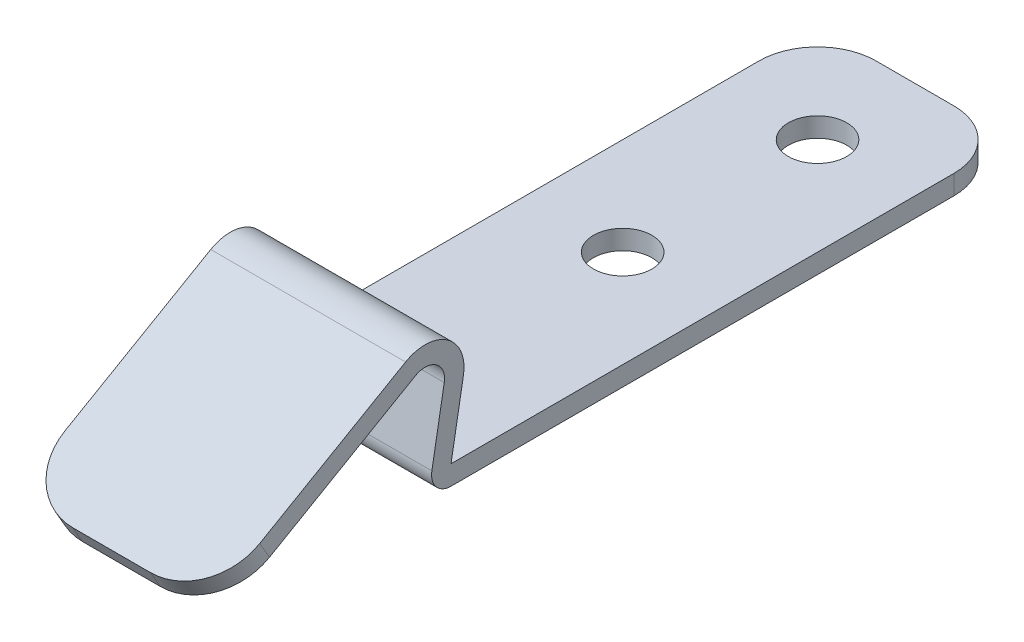
ISO-10303-21;
HEADER;
FILE_DESCRIPTION(('STEP AP214'),'2;1');
FILE_NAME('part.step','',(''),(''),'','','');
FILE_SCHEMA(('AUTOMOTIVE_DESIGN { 1 0 10303 214 1 1 1 1 }'));
ENDSEC;
DATA;
#1=APPLICATION_CONTEXT('core data for automotive mechanical design processes');
#2=APPLICATION_PROTOCOL_DEFINITION('international standard','automotive_design',2000,#1);
#3=PRODUCT_CONTEXT('',#1,'mechanical');
#4=PRODUCT('Part','Part','',(#3));
#5=PRODUCT_RELATED_PRODUCT_CATEGORY('part','',(#4));
#6=PRODUCT_DEFINITION_FORMATION('','',#4);
#7=PRODUCT_DEFINITION_CONTEXT('part definition',#1,'design');
#8=PRODUCT_DEFINITION('design','',#6,#7);
#9=PRODUCT_DEFINITION_SHAPE('','',#8);
#10=(LENGTH_UNIT() NAMED_UNIT(*) SI_UNIT(.MILLI.,.METRE.));
#11=(NAMED_UNIT(*) PLANE_ANGLE_UNIT() SI_UNIT($,.RADIAN.));
#12=(NAMED_UNIT(*) SI_UNIT($,.STERADIAN.) SOLID_ANGLE_UNIT());
#13=UNCERTAINTY_MEASURE_WITH_UNIT(LENGTH_MEASURE(1.E-05),#10,'distance_accuracy_value','');
#14=(GEOMETRIC_REPRESENTATION_CONTEXT(3) GLOBAL_UNCERTAINTY_ASSIGNED_CONTEXT((#13)) GLOBAL_UNIT_ASSIGNED_CONTEXT((#10,
#11,#12)) REPRESENTATION_CONTEXT('',''));
#15=CARTESIAN_POINT('',(0.,0.,0.));
#16=DIRECTION('',(0.,0.,1.));
#17=DIRECTION('',(1.,0.,0.));
#18=AXIS2_PLACEMENT_3D('',#15,#16,#17);
#19=CARTESIAN_POINT('',(5.,6.6874262146151,31.1416602280843));
#20=DIRECTION('',(0.,-0.866025403784438,-0.500000000000001));
#21=DIRECTION('',(0.,0.500000000000001,-0.866025403784438));
#22=AXIS2_PLACEMENT_3D('',#19,#20,#21);
#23=PLANE('',#22);
#24=DIRECTION('',(0.,-0.500000000000001,0.866025403784438));
#25=VECTOR('',#24,1.);
#26=CARTESIAN_POINT('',(-5.,6.6874262146151,31.1416602280843));
#27=LINE('',#26,#25);
#28=CARTESIAN_POINT('',(-5.,6.6874262146151,31.1416602280843));
#29=VERTEX_POINT('',#28);
#30=CARTESIAN_POINT('',(-5.,2.36602540378444,38.6265459923123));
#31=VERTEX_POINT('',#30);
#32=EDGE_CURVE('E185',#29,#31,#27,.T.);
#33=ORIENTED_EDGE('',*,*,#32,.T.);
#34=CARTESIAN_POINT('',(-2.,2.36602540378444,38.6265459923123));
#35=DIRECTION('',(0.,-0.866025403784438,-0.500000000000001));
#36=DIRECTION('',(0.,0.500000000000001,-0.866025403784438));
#37=AXIS2_PLACEMENT_3D('',#34,#35,#36);
#38=CIRCLE('',#37,3.);
#39=CARTESIAN_POINT('',(-2.,0.866025403784435,41.2246222036656));
#40=VERTEX_POINT('',#39);
#41=EDGE_CURVE('E253',#31,#40,#38,.F.);
#42=ORIENTED_EDGE('',*,*,#41,.T.);
#43=DIRECTION('',(-1.,0.,0.));
#44=VECTOR('',#43,1.);
#45=CARTESIAN_POINT('',(5.,0.866025403784435,41.2246222036656));
#46=LINE('',#45,#44);
#47=CARTESIAN_POINT('',(2.,0.866025403784435,41.2246222036656));
#48=VERTEX_POINT('',#47);
#49=EDGE_CURVE('E227',#48,#40,#46,.T.);
#50=ORIENTED_EDGE('',*,*,#49,.F.);
#51=CARTESIAN_POINT('',(2.,2.36602540378444,38.6265459923123));
#52=DIRECTION('',(0.,-0.866025403784438,-0.500000000000001));
#53=DIRECTION('',(0.,0.500000000000001,-0.866025403784438));
#54=AXIS2_PLACEMENT_3D('',#51,#52,#53);
#55=CIRCLE('',#54,3.);
#56=CARTESIAN_POINT('',(5.,2.36602540378444,38.6265459923123));
#57=VERTEX_POINT('',#56);
#58=EDGE_CURVE('E251',#48,#57,#55,.F.);
#59=ORIENTED_EDGE('',*,*,#58,.T.);
#60=DIRECTION('',(0.,-0.500000000000001,0.866025403784438));
#61=VECTOR('',#60,1.);
#62=CARTESIAN_POINT('',(5.,6.6874262146151,31.1416602280843));
#63=LINE('',#62,#61);
#64=CARTESIAN_POINT('',(5.,6.6874262146151,31.1416602280843));
#65=VERTEX_POINT('',#64);
#66=EDGE_CURVE('E165',#65,#57,#63,.T.);
#67=ORIENTED_EDGE('',*,*,#66,.F.);
#68=DIRECTION('',(-1.,0.,0.));
#69=VECTOR('',#68,1.);
#70=CARTESIAN_POINT('',(5.,6.6874262146151,31.1416602280843));
#71=LINE('',#70,#69);
#72=EDGE_CURVE('E184',#65,#29,#71,.T.);
#73=ORIENTED_EDGE('',*,*,#72,.T.);
#74=EDGE_LOOP('',(#33,#42,#50,#59,#67,#73));
#75=FACE_BOUND('',#74,.T.);
#76=ADVANCED_FACE('F37',(#75),#23,.F.);
#77=CARTESIAN_POINT('',(5.,0.,40.7246222036656));
#78=DIRECTION('',(0.,-0.5,0.866025403784439));
#79=DIRECTION('',(0.,-0.866025403784439,-0.5));
#80=AXIS2_PLACEMENT_3D('',#77,#78,#79);
#81=PLANE('',#80);
#82=ORIENTED_EDGE('',*,*,#49,.T.);
#83=DIRECTION('',(0.,0.866025403784439,0.5));
#84=VECTOR('',#83,1.);
#85=CARTESIAN_POINT('',(-2.,0.,40.7246222036656));
#86=LINE('',#85,#84);
#87=CARTESIAN_POINT('',(-2.,0.,40.7246222036656));
#88=VERTEX_POINT('',#87);
#89=EDGE_CURVE('E52',#40,#88,#86,.F.);
#90=ORIENTED_EDGE('',*,*,#89,.T.);
#91=DIRECTION('',(-1.,0.,0.));
#92=VECTOR('',#91,1.);
#93=CARTESIAN_POINT('',(5.,0.,40.7246222036656));
#94=LINE('',#93,#92);
#95=CARTESIAN_POINT('',(2.,0.,40.7246222036656));
#96=VERTEX_POINT('',#95);
#97=EDGE_CURVE('E152',#96,#88,#94,.T.);
#98=ORIENTED_EDGE('',*,*,#97,.F.);
#99=DIRECTION('',(0.,0.866025403784439,0.5));
#100=VECTOR('',#99,1.);
#101=CARTESIAN_POINT('',(2.,0.,40.7246222036656));
#102=LINE('',#101,#100);
#103=EDGE_CURVE('E255',#96,#48,#102,.T.);
#104=ORIENTED_EDGE('',*,*,#103,.T.);
#105=EDGE_LOOP('',(#82,#90,#98,#104));
#106=FACE_BOUND('',#105,.T.);
#107=ADVANCED_FACE('F260',(#106),#81,.T.);
#108=CARTESIAN_POINT('',(5.,5.82140081083066,30.6416602280843));
#109=DIRECTION('',(0.,-0.866025403784438,-0.500000000000001));
#110=DIRECTION('',(0.,0.500000000000001,-0.866025403784438));
#111=AXIS2_PLACEMENT_3D('',#108,#109,#110);
#112=PLANE('',#111);
#113=ORIENTED_EDGE('',*,*,#97,.T.);
#114=CARTESIAN_POINT('',(-2.,1.5,38.1265459923123));
#115=DIRECTION('',(0.,-0.866025403784438,-0.500000000000001));
#116=DIRECTION('',(0.,0.500000000000001,-0.866025403784438));
#117=AXIS2_PLACEMENT_3D('',#114,#115,#116);
#118=CIRCLE('',#117,3.);
#119=CARTESIAN_POINT('',(-5.,1.5,38.1265459923123));
#120=VERTEX_POINT('',#119);
#121=EDGE_CURVE('E11',#88,#120,#118,.T.);
#122=ORIENTED_EDGE('',*,*,#121,.T.);
#123=DIRECTION('',(0.,-0.500000000000001,0.866025403784438));
#124=VECTOR('',#123,1.);
#125=CARTESIAN_POINT('',(-5.,5.82140081083066,30.6416602280843));
#126=LINE('',#125,#124);
#127=CARTESIAN_POINT('',(-5.,5.82140081083066,30.6416602280843));
#128=VERTEX_POINT('',#127);
#129=EDGE_CURVE('E147',#128,#120,#126,.T.);
#130=ORIENTED_EDGE('',*,*,#129,.F.);
#131=DIRECTION('',(-1.,0.,0.));
#132=VECTOR('',#131,1.);
#133=CARTESIAN_POINT('',(5.,5.82140081083066,30.6416602280843));
#134=LINE('',#133,#132);
#135=CARTESIAN_POINT('',(5.,5.82140081083066,30.6416602280843));
#136=VERTEX_POINT('',#135);
#137=EDGE_CURVE('E142',#136,#128,#134,.T.);
#138=ORIENTED_EDGE('',*,*,#137,.F.);
#139=DIRECTION('',(0.,-0.500000000000001,0.866025403784438));
#140=VECTOR('',#139,1.);
#141=CARTESIAN_POINT('',(5.,5.82140081083066,30.6416602280843));
#142=LINE('',#141,#140);
#143=CARTESIAN_POINT('',(5.,1.5,38.1265459923123));
#144=VERTEX_POINT('',#143);
#145=EDGE_CURVE('E145',#136,#144,#142,.T.);
#146=ORIENTED_EDGE('',*,*,#145,.T.);
#147=CARTESIAN_POINT('',(2.,1.5,38.1265459923123));
#148=DIRECTION('',(0.,-0.866025403784438,-0.500000000000001));
#149=DIRECTION('',(0.,0.500000000000001,-0.866025403784438));
#150=AXIS2_PLACEMENT_3D('',#147,#148,#149);
#151=CIRCLE('',#150,3.);
#152=EDGE_CURVE('E45',#144,#96,#151,.T.);
#153=ORIENTED_EDGE('',*,*,#152,.T.);
#154=EDGE_LOOP('',(#113,#122,#130,#138,#146,#153));
#155=FACE_BOUND('',#154,.T.);
#156=ADVANCED_FACE('F144',(#155),#112,.T.);
#157=CARTESIAN_POINT('',(5.,4.95537540704622,30.1416602280843));
#158=DIRECTION('',(-1.,0.,0.));
#159=DIRECTION('',(0.,0.,1.));
#160=AXIS2_PLACEMENT_3D('',#157,#158,#159);
#161=CYLINDRICAL_SURFACE('',#160,1.);
#162=CARTESIAN_POINT('',(-5.,4.95537540704622,30.1416602280843));
#163=DIRECTION('',(1.,0.,0.));
#164=DIRECTION('',(0.,0.,-1.));
#165=AXIS2_PLACEMENT_3D('',#162,#163,#164);
#166=CIRCLE('',#165,1.);
#167=CARTESIAN_POINT('',(-5.,4.78172722937929,29.1568524750721));
#168=VERTEX_POINT('',#167);
#169=EDGE_CURVE('E190',#168,#128,#166,.T.);
#170=ORIENTED_EDGE('',*,*,#169,.F.);
#171=DIRECTION('',(-1.,0.,0.));
#172=VECTOR('',#171,1.);
#173=CARTESIAN_POINT('',(5.,4.78172722937929,29.1568524750721));
#174=LINE('',#173,#172);
#175=CARTESIAN_POINT('',(5.,4.78172722937929,29.1568524750721));
#176=VERTEX_POINT('',#175);
#177=EDGE_CURVE('E153',#176,#168,#174,.T.);
#178=ORIENTED_EDGE('',*,*,#177,.F.);
#179=CARTESIAN_POINT('',(5.,4.95537540704622,30.1416602280843));
#180=DIRECTION('',(1.,0.,0.));
#181=DIRECTION('',(0.,0.,-1.));
#182=AXIS2_PLACEMENT_3D('',#179,#180,#181);
#183=CIRCLE('',#182,1.);
#184=EDGE_CURVE('E160',#176,#136,#183,.T.);
#185=ORIENTED_EDGE('',*,*,#184,.T.);
#186=ORIENTED_EDGE('',*,*,#137,.T.);
#187=EDGE_LOOP('',(#170,#178,#185,#186));
#188=FACE_BOUND('',#187,.T.);
#189=ADVANCED_FACE('F167',(#188),#161,.F.);
#190=CARTESIAN_POINT('',(5.,1.17364817766693,29.793054160418));
#191=DIRECTION('',(0.,0.173648177666933,0.984807753012208));
#192=DIRECTION('',(0.,-0.984807753012208,0.173648177666933));
#193=AXIS2_PLACEMENT_3D('',#190,#191,#192);
#194=PLANE('',#193);
#195=DIRECTION('',(0.,0.984807753012208,-0.173648177666933));
#196=VECTOR('',#195,1.);
#197=CARTESIAN_POINT('',(-5.,1.17364817766693,29.793054160418));
#198=LINE('',#197,#196);
#199=CARTESIAN_POINT('',(-5.,1.17364817766693,29.793054160418));
#200=VERTEX_POINT('',#199);
#201=EDGE_CURVE('E192',#200,#168,#198,.T.);
#202=ORIENTED_EDGE('',*,*,#201,.F.);
#203=DIRECTION('',(-1.,0.,0.));
#204=VECTOR('',#203,1.);
#205=CARTESIAN_POINT('',(5.,1.17364817766693,29.793054160418));
#206=LINE('',#205,#204);
#207=CARTESIAN_POINT('',(5.,1.17364817766693,29.793054160418));
#208=VERTEX_POINT('',#207);
#209=EDGE_CURVE('E223',#208,#200,#206,.T.);
#210=ORIENTED_EDGE('',*,*,#209,.F.);
#211=DIRECTION('',(0.,0.984807753012208,-0.173648177666933));
#212=VECTOR('',#211,1.);
#213=CARTESIAN_POINT('',(5.,1.17364817766693,29.793054160418));
#214=LINE('',#213,#212);
#215=EDGE_CURVE('E168',#208,#176,#214,.T.);
#216=ORIENTED_EDGE('',*,*,#215,.T.);
#217=ORIENTED_EDGE('',*,*,#177,.T.);
#218=EDGE_LOOP('',(#202,#210,#216,#217));
#219=FACE_BOUND('',#218,.T.);
#220=ADVANCED_FACE('F276',(#219),#194,.T.);
#221=CARTESIAN_POINT('',(5.,0.999999999999997,28.8082464074058));
#222=DIRECTION('',(-1.,0.,0.));
#223=DIRECTION('',(0.,0.,1.));
#224=AXIS2_PLACEMENT_3D('',#221,#222,#223);
#225=CYLINDRICAL_SURFACE('',#224,0.999999999999999);
#226=CARTESIAN_POINT('',(-5.,0.999999999999997,28.8082464074058));
#227=DIRECTION('',(-1.,0.,0.));
#228=DIRECTION('',(0.,0.,1.));
#229=AXIS2_PLACEMENT_3D('',#226,#227,#228);
#230=CIRCLE('',#229,0.999999999999999);
#231=CARTESIAN_POINT('',(-5.,0.,28.8082464074058));
#232=VERTEX_POINT('',#231);
#233=EDGE_CURVE('E195',#232,#200,#230,.T.);
#234=ORIENTED_EDGE('',*,*,#233,.F.);
#235=DIRECTION('',(-1.,0.,0.));
#236=VECTOR('',#235,1.);
#237=CARTESIAN_POINT('',(5.,0.,28.8082464074058));
#238=LINE('',#237,#236);
#239=CARTESIAN_POINT('',(5.,0.,28.8082464074058));
#240=VERTEX_POINT('',#239);
#241=EDGE_CURVE('E220',#240,#232,#238,.T.);
#242=ORIENTED_EDGE('',*,*,#241,.F.);
#243=CARTESIAN_POINT('',(5.,0.999999999999997,28.8082464074058));
#244=DIRECTION('',(-1.,0.,0.));
#245=DIRECTION('',(0.,0.,1.));
#246=AXIS2_PLACEMENT_3D('',#243,#244,#245);
#247=CIRCLE('',#246,0.999999999999999);
#248=EDGE_CURVE('E170',#240,#208,#247,.T.);
#249=ORIENTED_EDGE('',*,*,#248,.T.);
#250=ORIENTED_EDGE('',*,*,#209,.T.);
#251=EDGE_LOOP('',(#234,#242,#249,#250));
#252=FACE_BOUND('',#251,.T.);
#253=ADVANCED_FACE('F280',(#252),#225,.T.);
#254=CARTESIAN_POINT('',(5.,0.,0.));
#255=DIRECTION('',(0.,-1.,0.));
#256=DIRECTION('',(0.,0.,-1.));
#257=AXIS2_PLACEMENT_3D('',#254,#255,#256);
#258=PLANE('',#257);
#259=CARTESIAN_POINT('',(0.,0.,15.));
#260=DIRECTION('',(0.,-1.,0.));
#261=DIRECTION('',(0.,0.,-1.));
#262=AXIS2_PLACEMENT_3D('',#259,#260,#261);
#263=CIRCLE('',#262,1.5);
#264=CARTESIAN_POINT('',(0.,0.,13.5));
#265=VERTEX_POINT('',#264);
#266=EDGE_CURVE('E470',#265,#265,#263,.T.);
#267=ORIENTED_EDGE('',*,*,#266,.F.);
#268=EDGE_LOOP('',(#267));
#269=FACE_BOUND('',#268,.T.);
#270=CARTESIAN_POINT('',(0.,0.,5.));
#271=DIRECTION('',(0.,-1.,0.));
#272=DIRECTION('',(0.,0.,-1.));
#273=AXIS2_PLACEMENT_3D('',#270,#271,#272);
#274=CIRCLE('',#273,1.5);
#275=CARTESIAN_POINT('',(0.,0.,3.5));
#276=VERTEX_POINT('',#275);
#277=EDGE_CURVE('E188',#276,#276,#274,.T.);
#278=ORIENTED_EDGE('',*,*,#277,.F.);
#279=EDGE_LOOP('',(#278));
#280=FACE_BOUND('',#279,.T.);
#281=DIRECTION('',(-1.,0.,0.));
#282=VECTOR('',#281,1.);
#283=CARTESIAN_POINT('',(5.,0.,0.));
#284=LINE('',#283,#282);
#285=CARTESIAN_POINT('',(2.,0.,0.));
#286=VERTEX_POINT('',#285);
#287=CARTESIAN_POINT('',(-2.,0.,0.));
#288=VERTEX_POINT('',#287);
#289=EDGE_CURVE('E217',#286,#288,#284,.T.);
#290=ORIENTED_EDGE('',*,*,#289,.F.);
#291=CARTESIAN_POINT('',(2.,0.,3.));
#292=DIRECTION('',(0.,-1.,0.));
#293=DIRECTION('',(0.,0.,-1.));
#294=AXIS2_PLACEMENT_3D('',#291,#292,#293);
#295=CIRCLE('',#294,3.);
#296=CARTESIAN_POINT('',(5.,0.,3.));
#297=VERTEX_POINT('',#296);
#298=EDGE_CURVE('E236',#286,#297,#295,.T.);
#299=ORIENTED_EDGE('',*,*,#298,.T.);
#300=DIRECTION('',(0.,0.,1.));
#301=VECTOR('',#300,1.);
#302=CARTESIAN_POINT('',(5.,0.,0.));
#303=LINE('',#302,#301);
#304=EDGE_CURVE('E176',#297,#240,#303,.T.);
#305=ORIENTED_EDGE('',*,*,#304,.T.);
#306=ORIENTED_EDGE('',*,*,#241,.T.);
#307=DIRECTION('',(0.,0.,1.));
#308=VECTOR('',#307,1.);
#309=CARTESIAN_POINT('',(-5.,0.,0.));
#310=LINE('',#309,#308);
#311=CARTESIAN_POINT('',(-5.,0.,3.));
#312=VERTEX_POINT('',#311);
#313=EDGE_CURVE('E198',#312,#232,#310,.T.);
#314=ORIENTED_EDGE('',*,*,#313,.F.);
#315=CARTESIAN_POINT('',(-2.,0.,3.));
#316=DIRECTION('',(0.,-1.,0.));
#317=DIRECTION('',(0.,0.,-1.));
#318=AXIS2_PLACEMENT_3D('',#315,#316,#317);
#319=CIRCLE('',#318,3.);
#320=EDGE_CURVE('E234',#312,#288,#319,.T.);
#321=ORIENTED_EDGE('',*,*,#320,.T.);
#322=EDGE_LOOP('',(#290,#299,#305,#306,#314,#321));
#323=FACE_BOUND('',#322,.T.);
#324=ADVANCED_FACE('F284',(#269,#280,#323),#258,.T.);
#325=CARTESIAN_POINT('',(5.,1.,0.));
#326=DIRECTION('',(0.,0.,-1.));
#327=DIRECTION('',(0.,1.,0.));
#328=AXIS2_PLACEMENT_3D('',#325,#326,#327);
#329=PLANE('',#328);
#330=DIRECTION('',(-1.,0.,0.));
#331=VECTOR('',#330,1.);
#332=CARTESIAN_POINT('',(5.,1.,0.));
#333=LINE('',#332,#331);
#334=CARTESIAN_POINT('',(2.,1.,0.));
#335=VERTEX_POINT('',#334);
#336=CARTESIAN_POINT('',(-2.,1.,0.));
#337=VERTEX_POINT('',#336);
#338=EDGE_CURVE('E214',#335,#337,#333,.T.);
#339=ORIENTED_EDGE('',*,*,#338,.F.);
#340=DIRECTION('',(0.,-1.,0.));
#341=VECTOR('',#340,1.);
#342=CARTESIAN_POINT('',(2.,1.,0.));
#343=LINE('',#342,#341);
#344=EDGE_CURVE('E231',#335,#286,#343,.T.);
#345=ORIENTED_EDGE('',*,*,#344,.T.);
#346=ORIENTED_EDGE('',*,*,#289,.T.);
#347=DIRECTION('',(0.,-1.,0.));
#348=VECTOR('',#347,1.);
#349=CARTESIAN_POINT('',(-2.,1.,0.));
#350=LINE('',#349,#348);
#351=EDGE_CURVE('E229',#288,#337,#350,.F.);
#352=ORIENTED_EDGE('',*,*,#351,.T.);
#353=EDGE_LOOP('',(#339,#345,#346,#352));
#354=FACE_BOUND('',#353,.T.);
#355=ADVANCED_FACE('F297',(#354),#329,.T.);
#356=CARTESIAN_POINT('',(5.,1.,0.));
#357=DIRECTION('',(0.,-1.,0.));
#358=DIRECTION('',(0.,0.,-1.));
#359=AXIS2_PLACEMENT_3D('',#356,#357,#358);
#360=PLANE('',#359);
#361=CARTESIAN_POINT('',(0.,0.999999999999998,15.));
#362=DIRECTION('',(0.,1.,0.));
#363=DIRECTION('',(0.,0.,1.));
#364=AXIS2_PLACEMENT_3D('',#361,#362,#363);
#365=CIRCLE('',#364,1.5);
#366=CARTESIAN_POINT('',(0.,0.999999999999998,16.5));
#367=VERTEX_POINT('',#366);
#368=EDGE_CURVE('E473',#367,#367,#365,.T.);
#369=ORIENTED_EDGE('',*,*,#368,.F.);
#370=EDGE_LOOP('',(#369));
#371=FACE_BOUND('',#370,.T.);
#372=CARTESIAN_POINT('',(0.,0.999999999999999,5.));
#373=DIRECTION('',(0.,1.,0.));
#374=DIRECTION('',(0.,0.,1.));
#375=AXIS2_PLACEMENT_3D('',#372,#373,#374);
#376=CIRCLE('',#375,1.5);
#377=CARTESIAN_POINT('',(0.,0.999999999999999,6.5));
#378=VERTEX_POINT('',#377);
#379=EDGE_CURVE('E475',#378,#378,#376,.T.);
#380=ORIENTED_EDGE('',*,*,#379,.F.);
#381=EDGE_LOOP('',(#380));
#382=FACE_BOUND('',#381,.T.);
#383=DIRECTION('',(0.,0.,1.));
#384=VECTOR('',#383,1.);
#385=CARTESIAN_POINT('',(5.,1.,0.));
#386=LINE('',#385,#384);
#387=CARTESIAN_POINT('',(5.,1.,3.));
#388=VERTEX_POINT('',#387);
#389=CARTESIAN_POINT('',(5.,0.999999999999997,28.8082464074058));
#390=VERTEX_POINT('',#389);
#391=EDGE_CURVE('E178',#388,#390,#386,.T.);
#392=ORIENTED_EDGE('',*,*,#391,.F.);
#393=CARTESIAN_POINT('',(2.,1.,3.));
#394=DIRECTION('',(0.,-1.,0.));
#395=DIRECTION('',(0.,0.,-1.));
#396=AXIS2_PLACEMENT_3D('',#393,#394,#395);
#397=CIRCLE('',#396,3.);
#398=EDGE_CURVE('E243',#388,#335,#397,.F.);
#399=ORIENTED_EDGE('',*,*,#398,.T.);
#400=ORIENTED_EDGE('',*,*,#338,.T.);
#401=CARTESIAN_POINT('',(-2.,1.,3.));
#402=DIRECTION('',(0.,-1.,0.));
#403=DIRECTION('',(0.,0.,-1.));
#404=AXIS2_PLACEMENT_3D('',#401,#402,#403);
#405=CIRCLE('',#404,3.);
#406=CARTESIAN_POINT('',(-5.,1.,3.));
#407=VERTEX_POINT('',#406);
#408=EDGE_CURVE('E241',#337,#407,#405,.F.);
#409=ORIENTED_EDGE('',*,*,#408,.T.);
#410=DIRECTION('',(0.,0.,1.));
#411=VECTOR('',#410,1.);
#412=CARTESIAN_POINT('',(-5.,1.,0.));
#413=LINE('',#412,#411);
#414=CARTESIAN_POINT('',(-5.,0.999999999999997,28.8082464074058));
#415=VERTEX_POINT('',#414);
#416=EDGE_CURVE('E200',#407,#415,#413,.T.);
#417=ORIENTED_EDGE('',*,*,#416,.T.);
#418=DIRECTION('',(-1.,0.,0.));
#419=VECTOR('',#418,1.);
#420=CARTESIAN_POINT('',(5.,0.999999999999997,28.8082464074058));
#421=LINE('',#420,#419);
#422=EDGE_CURVE('E211',#390,#415,#421,.T.);
#423=ORIENTED_EDGE('',*,*,#422,.F.);
#424=EDGE_LOOP('',(#392,#399,#400,#409,#417,#423));
#425=FACE_BOUND('',#424,.T.);
#426=ADVANCED_FACE('F293',(#371,#382,#425),#360,.F.);
#427=CARTESIAN_POINT('',(5.,0.999999999999997,28.8082464074058));
#428=DIRECTION('',(0.,0.173648177666933,0.984807753012208));
#429=DIRECTION('',(0.,-0.984807753012208,0.173648177666933));
#430=AXIS2_PLACEMENT_3D('',#427,#428,#429);
#431=PLANE('',#430);
#432=DIRECTION('',(0.,0.984807753012208,-0.173648177666933));
#433=VECTOR('',#432,1.);
#434=CARTESIAN_POINT('',(-5.,0.999999999999997,28.8082464074058));
#435=LINE('',#434,#433);
#436=CARTESIAN_POINT('',(-5.,4.60807905171236,28.1720447220599));
#437=VERTEX_POINT('',#436);
#438=EDGE_CURVE('E202',#415,#437,#435,.T.);
#439=ORIENTED_EDGE('',*,*,#438,.T.);
#440=DIRECTION('',(-1.,0.,0.));
#441=VECTOR('',#440,1.);
#442=CARTESIAN_POINT('',(5.,4.60807905171236,28.1720447220599));
#443=LINE('',#442,#441);
#444=CARTESIAN_POINT('',(5.,4.60807905171236,28.1720447220599));
#445=VERTEX_POINT('',#444);
#446=EDGE_CURVE('E208',#445,#437,#443,.T.);
#447=ORIENTED_EDGE('',*,*,#446,.F.);
#448=DIRECTION('',(0.,0.984807753012208,-0.173648177666933));
#449=VECTOR('',#448,1.);
#450=CARTESIAN_POINT('',(5.,0.999999999999997,28.8082464074058));
#451=LINE('',#450,#449);
#452=EDGE_CURVE('E180',#390,#445,#451,.T.);
#453=ORIENTED_EDGE('',*,*,#452,.F.);
#454=ORIENTED_EDGE('',*,*,#422,.T.);
#455=EDGE_LOOP('',(#439,#447,#453,#454));
#456=FACE_BOUND('',#455,.T.);
#457=ADVANCED_FACE('F305',(#456),#431,.F.);
#458=CARTESIAN_POINT('',(5.,4.95537540704622,30.1416602280843));
#459=DIRECTION('',(-1.,0.,0.));
#460=DIRECTION('',(0.,0.,1.));
#461=AXIS2_PLACEMENT_3D('',#458,#459,#460);
#462=CYLINDRICAL_SURFACE('',#461,2.);
#463=CARTESIAN_POINT('',(-5.,4.95537540704622,30.1416602280843));
#464=DIRECTION('',(1.,0.,0.));
#465=DIRECTION('',(0.,0.,-1.));
#466=AXIS2_PLACEMENT_3D('',#463,#464,#465);
#467=CIRCLE('',#466,2.);
#468=EDGE_CURVE('E204',#437,#29,#467,.T.);
#469=ORIENTED_EDGE('',*,*,#468,.T.);
#470=ORIENTED_EDGE('',*,*,#72,.F.);
#471=CARTESIAN_POINT('',(5.,4.95537540704622,30.1416602280843));
#472=DIRECTION('',(1.,0.,0.));
#473=DIRECTION('',(0.,0.,-1.));
#474=AXIS2_PLACEMENT_3D('',#471,#472,#473);
#475=CIRCLE('',#474,2.);
#476=EDGE_CURVE('E182',#445,#65,#475,.T.);
#477=ORIENTED_EDGE('',*,*,#476,.F.);
#478=ORIENTED_EDGE('',*,*,#446,.T.);
#479=EDGE_LOOP('',(#469,#470,#477,#478));
#480=FACE_BOUND('',#479,.T.);
#481=ADVANCED_FACE('F309',(#480),#462,.T.);
#482=CARTESIAN_POINT('',(5.,4.95537540704622,30.1416602280843));
#483=DIRECTION('',(1.,0.,0.));
#484=DIRECTION('',(0.,0.,-1.));
#485=AXIS2_PLACEMENT_3D('',#482,#483,#484);
#486=PLANE('',#485);
#487=ORIENTED_EDGE('',*,*,#304,.F.);
#488=DIRECTION('',(0.,-1.,0.));
#489=VECTOR('',#488,1.);
#490=CARTESIAN_POINT('',(5.,4.95537540704623,3.));
#491=LINE('',#490,#489);
#492=EDGE_CURVE('E239',#297,#388,#491,.F.);
#493=ORIENTED_EDGE('',*,*,#492,.T.);
#494=ORIENTED_EDGE('',*,*,#391,.T.);
#495=ORIENTED_EDGE('',*,*,#452,.T.);
#496=ORIENTED_EDGE('',*,*,#476,.T.);
#497=ORIENTED_EDGE('',*,*,#66,.T.);
#498=DIRECTION('',(0.,0.866025403784439,0.5));
#499=VECTOR('',#498,1.);
#500=CARTESIAN_POINT('',(5.,0.633974596215572,37.6265459923123));
#501=LINE('',#500,#499);
#502=EDGE_CURVE('E164',#57,#144,#501,.F.);
#503=ORIENTED_EDGE('',*,*,#502,.T.);
#504=ORIENTED_EDGE('',*,*,#145,.F.);
#505=ORIENTED_EDGE('',*,*,#184,.F.);
#506=ORIENTED_EDGE('',*,*,#215,.F.);
#507=ORIENTED_EDGE('',*,*,#248,.F.);
#508=EDGE_LOOP('',(#487,#493,#494,#495,#496,#497,#503,#504,#505,#506,#507));
#509=FACE_BOUND('',#508,.T.);
#510=ADVANCED_FACE('F158',(#509),#486,.T.);
#511=CARTESIAN_POINT('',(-5.,4.95537540704622,30.1416602280843));
#512=DIRECTION('',(1.,0.,0.));
#513=DIRECTION('',(0.,0.,-1.));
#514=AXIS2_PLACEMENT_3D('',#511,#512,#513);
#515=PLANE('',#514);
#516=ORIENTED_EDGE('',*,*,#416,.F.);
#517=DIRECTION('',(0.,-1.,0.));
#518=VECTOR('',#517,1.);
#519=CARTESIAN_POINT('',(-5.,0.,3.));
#520=LINE('',#519,#518);
#521=EDGE_CURVE('E248',#407,#312,#520,.T.);
#522=ORIENTED_EDGE('',*,*,#521,.T.);
#523=ORIENTED_EDGE('',*,*,#313,.T.);
#524=ORIENTED_EDGE('',*,*,#233,.T.);
#525=ORIENTED_EDGE('',*,*,#201,.T.);
#526=ORIENTED_EDGE('',*,*,#169,.T.);
#527=ORIENTED_EDGE('',*,*,#129,.T.);
#528=DIRECTION('',(0.,0.866025403784439,0.5));
#529=VECTOR('',#528,1.);
#530=CARTESIAN_POINT('',(-5.,2.36602540378444,38.6265459923123));
#531=LINE('',#530,#529);
#532=EDGE_CURVE('E245',#120,#31,#531,.T.);
#533=ORIENTED_EDGE('',*,*,#532,.T.);
#534=ORIENTED_EDGE('',*,*,#32,.F.);
#535=ORIENTED_EDGE('',*,*,#468,.F.);
#536=ORIENTED_EDGE('',*,*,#438,.F.);
#537=EDGE_LOOP('',(#516,#522,#523,#524,#525,#526,#527,#533,#534,#535,#536));
#538=FACE_BOUND('',#537,.T.);
#539=ADVANCED_FACE('F271',(#538),#515,.F.);
#540=CARTESIAN_POINT('',(2.,1.,3.));
#541=DIRECTION('',(0.,-1.,0.));
#542=DIRECTION('',(0.,0.,-1.));
#543=AXIS2_PLACEMENT_3D('',#540,#541,#542);
#544=CYLINDRICAL_SURFACE('',#543,3.);
#545=ORIENTED_EDGE('',*,*,#398,.F.);
#546=ORIENTED_EDGE('',*,*,#492,.F.);
#547=ORIENTED_EDGE('',*,*,#298,.F.);
#548=ORIENTED_EDGE('',*,*,#344,.F.);
#549=EDGE_LOOP('',(#545,#546,#547,#548));
#550=FACE_BOUND('',#549,.T.);
#551=ADVANCED_FACE('F289',(#550),#544,.T.);
#552=CARTESIAN_POINT('',(-2.,4.95537540704623,3.));
#553=DIRECTION('',(0.,1.,0.));
#554=DIRECTION('',(0.,0.,1.));
#555=AXIS2_PLACEMENT_3D('',#552,#553,#554);
#556=CYLINDRICAL_SURFACE('',#555,3.);
#557=ORIENTED_EDGE('',*,*,#408,.F.);
#558=ORIENTED_EDGE('',*,*,#351,.F.);
#559=ORIENTED_EDGE('',*,*,#320,.F.);
#560=ORIENTED_EDGE('',*,*,#521,.F.);
#561=EDGE_LOOP('',(#557,#558,#559,#560));
#562=FACE_BOUND('',#561,.T.);
#563=ADVANCED_FACE('F300',(#562),#556,.T.);
#564=CARTESIAN_POINT('',(-2.,0.633974596215572,37.6265459923123));
#565=DIRECTION('',(0.,-0.866025403784439,-0.5));
#566=DIRECTION('',(0.,0.5,-0.866025403784439));
#567=AXIS2_PLACEMENT_3D('',#564,#565,#566);
#568=CYLINDRICAL_SURFACE('',#567,3.);
#569=ORIENTED_EDGE('',*,*,#121,.F.);
#570=ORIENTED_EDGE('',*,*,#89,.F.);
#571=ORIENTED_EDGE('',*,*,#41,.F.);
#572=ORIENTED_EDGE('',*,*,#532,.F.);
#573=EDGE_LOOP('',(#569,#570,#571,#572));
#574=FACE_BOUND('',#573,.T.);
#575=ADVANCED_FACE('F268',(#574),#568,.T.);
#576=CARTESIAN_POINT('',(2.,1.5,38.1265459923123));
#577=DIRECTION('',(0.,0.866025403784439,0.5));
#578=DIRECTION('',(0.,-0.5,0.866025403784439));
#579=AXIS2_PLACEMENT_3D('',#576,#577,#578);
#580=CYLINDRICAL_SURFACE('',#579,3.);
#581=ORIENTED_EDGE('',*,*,#152,.F.);
#582=ORIENTED_EDGE('',*,*,#502,.F.);
#583=ORIENTED_EDGE('',*,*,#58,.F.);
#584=ORIENTED_EDGE('',*,*,#103,.F.);
#585=EDGE_LOOP('',(#581,#582,#583,#584));
#586=FACE_BOUND('',#585,.T.);
#587=ADVANCED_FACE('F39',(#586),#580,.T.);
#588=CARTESIAN_POINT('',(0.,-9.,5.));
#589=DIRECTION('',(0.,1.,0.));
#590=DIRECTION('',(0.,0.,1.));
#591=AXIS2_PLACEMENT_3D('',#588,#589,#590);
#592=CYLINDRICAL_SURFACE('',#591,1.5);
#593=ORIENTED_EDGE('',*,*,#277,.T.);
#594=EDGE_LOOP('',(#593));
#595=FACE_BOUND('',#594,.T.);
#596=ORIENTED_EDGE('',*,*,#379,.T.);
#597=EDGE_LOOP('',(#596));
#598=FACE_BOUND('',#597,.T.);
#599=ADVANCED_FACE('F312',(#595,#598),#592,.F.);
#600=CARTESIAN_POINT('',(0.,-9.,15.));
#601=DIRECTION('',(0.,1.,0.));
#602=DIRECTION('',(0.,0.,1.));
#603=AXIS2_PLACEMENT_3D('',#600,#601,#602);
#604=CYLINDRICAL_SURFACE('',#603,1.5);
#605=ORIENTED_EDGE('',*,*,#266,.T.);
#606=EDGE_LOOP('',(#605));
#607=FACE_BOUND('',#606,.T.);
#608=ORIENTED_EDGE('',*,*,#368,.T.);
#609=EDGE_LOOP('',(#608));
#610=FACE_BOUND('',#609,.T.);
#611=ADVANCED_FACE('F317',(#607,#610),#604,.F.);
#612=CLOSED_SHELL('',(#76,#107,#156,#189,#220,#253,#324,#355,#426,#457,#481,#510,#539,#551,#563,
#575,#587,#599,#611));
#613=MANIFOLD_SOLID_BREP('B2',#612);
#614=ADVANCED_BREP_SHAPE_REPRESENTATION('',(#18,#613),#14);
#615=SHAPE_DEFINITION_REPRESENTATION(#9,#614);
ENDSEC;
END-ISO-10303-21;
